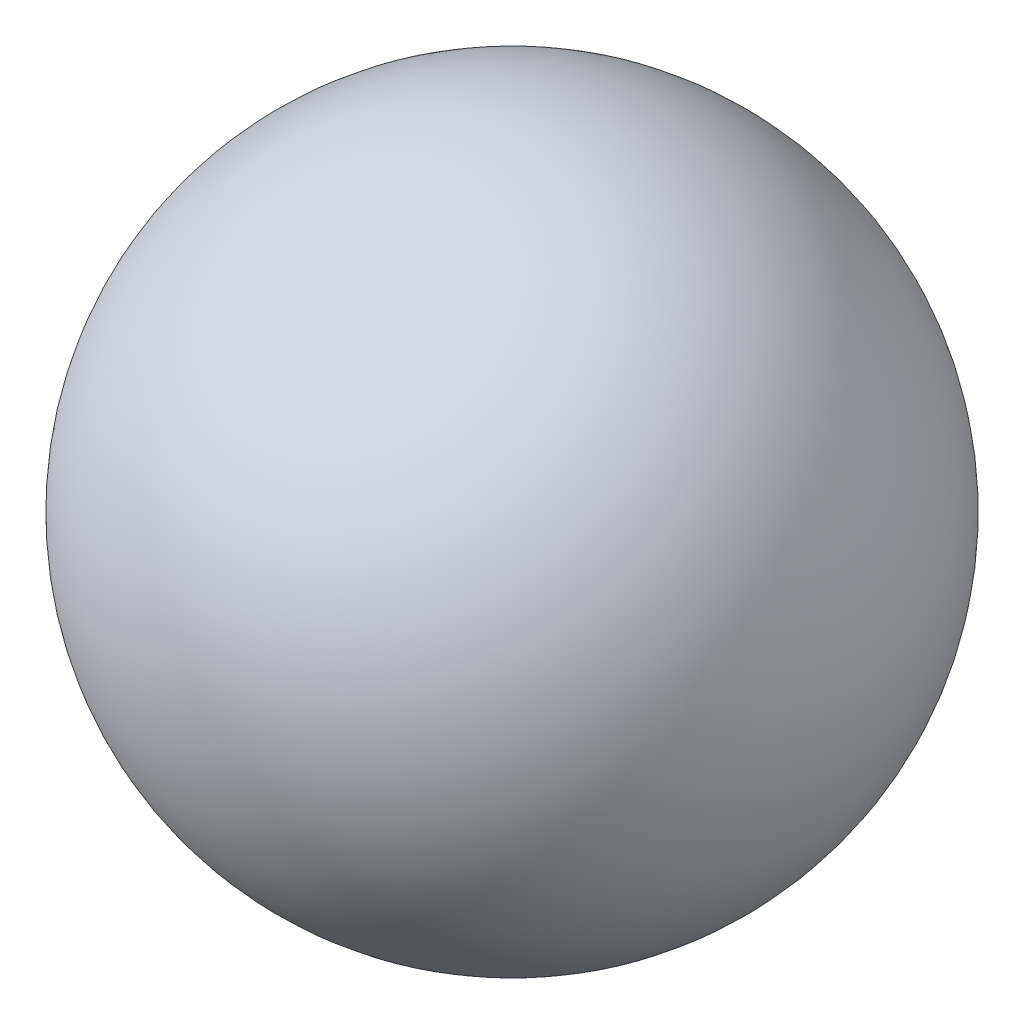
ISO-10303-21;
HEADER;
FILE_DESCRIPTION(('STEP AP214'),'2;1');
FILE_NAME('part.step','',(''),(''),'','','');
FILE_SCHEMA(('AUTOMOTIVE_DESIGN { 1 0 10303 214 1 1 1 1 }'));
ENDSEC;
DATA;
#1=APPLICATION_CONTEXT('core data for automotive mechanical design processes');
#2=APPLICATION_PROTOCOL_DEFINITION('international standard','automotive_design',2000,#1);
#3=PRODUCT_CONTEXT('',#1,'mechanical');
#4=PRODUCT('Part','Part','',(#3));
#5=PRODUCT_RELATED_PRODUCT_CATEGORY('part','',(#4));
#6=PRODUCT_DEFINITION_FORMATION('','',#4);
#7=PRODUCT_DEFINITION_CONTEXT('part definition',#1,'design');
#8=PRODUCT_DEFINITION('design','',#6,#7);
#9=PRODUCT_DEFINITION_SHAPE('','',#8);
#10=(LENGTH_UNIT() NAMED_UNIT(*) SI_UNIT(.MILLI.,.METRE.));
#11=(NAMED_UNIT(*) PLANE_ANGLE_UNIT() SI_UNIT($,.RADIAN.));
#12=(NAMED_UNIT(*) SI_UNIT($,.STERADIAN.) SOLID_ANGLE_UNIT());
#13=UNCERTAINTY_MEASURE_WITH_UNIT(LENGTH_MEASURE(1.E-05),#10,'distance_accuracy_value','');
#14=(GEOMETRIC_REPRESENTATION_CONTEXT(3) GLOBAL_UNCERTAINTY_ASSIGNED_CONTEXT((#13)) GLOBAL_UNIT_ASSIGNED_CONTEXT((#10,
#11,#12)) REPRESENTATION_CONTEXT('',''));
#15=CARTESIAN_POINT('',(0.,0.,0.));
#16=DIRECTION('',(0.,0.,1.));
#17=DIRECTION('',(1.,0.,0.));
#18=AXIS2_PLACEMENT_3D('',#15,#16,#17);
#19=CARTESIAN_POINT('',(0.,0.,0.));
#20=DIRECTION('',(0.,1.,0.));
#21=DIRECTION('',(1.,0.,0.));
#22=AXIS2_PLACEMENT_3D('',#19,#20,#21);
#23=SPHERICAL_SURFACE('',#22,11.5);
#24=CARTESIAN_POINT('',(0.,11.5,0.));
#25=VERTEX_POINT('',#24);
#26=VERTEX_LOOP('',#25);
#27=FACE_BOUND('',#26,.T.);
#28=ADVANCED_FACE('F33',(#27),#23,.T.);
#29=CLOSED_SHELL('',(#28));
#30=MANIFOLD_SOLID_BREP('B2',#29);
#31=ADVANCED_BREP_SHAPE_REPRESENTATION('',(#18,#30),#14);
#32=SHAPE_DEFINITION_REPRESENTATION(#9,#31);
ENDSEC;
END-ISO-10303-21;
